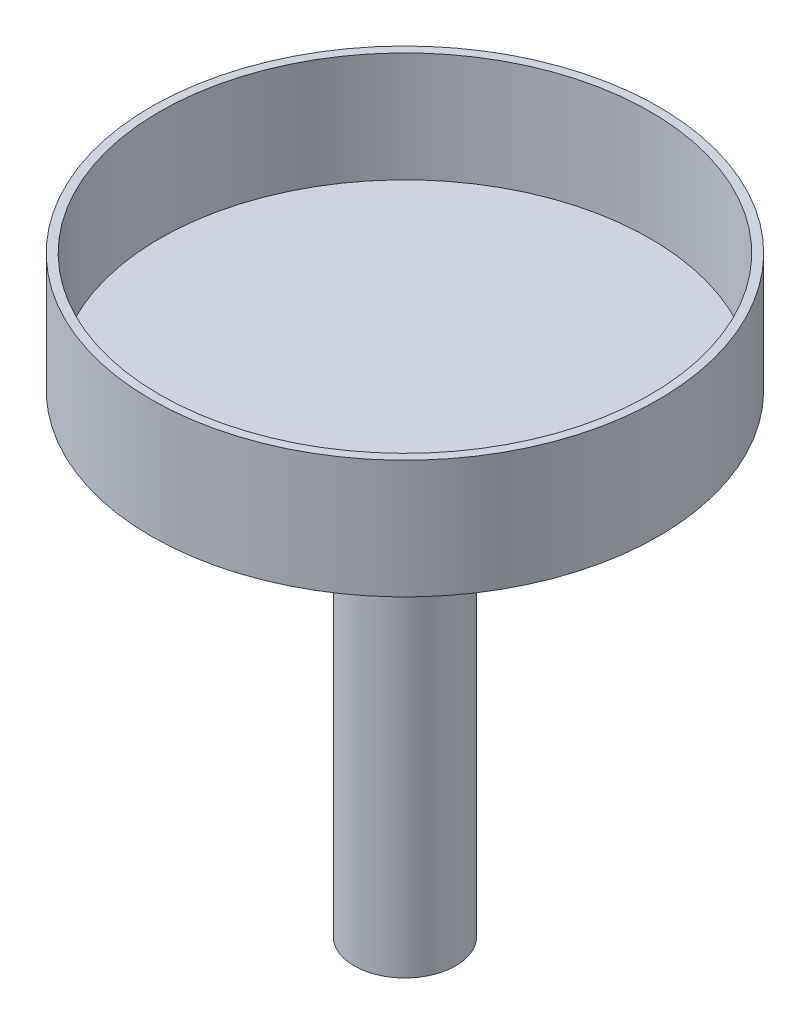
ISO-10303-21;
HEADER;
FILE_DESCRIPTION(('STEP AP214'),'2;1');
FILE_NAME('part.step','',(''),(''),'','','');
FILE_SCHEMA(('AUTOMOTIVE_DESIGN { 1 0 10303 214 1 1 1 1 }'));
ENDSEC;
DATA;
#1=APPLICATION_CONTEXT('core data for automotive mechanical design processes');
#2=APPLICATION_PROTOCOL_DEFINITION('international standard','automotive_design',2000,#1);
#3=PRODUCT_CONTEXT('',#1,'mechanical');
#4=PRODUCT('Part','Part','',(#3));
#5=PRODUCT_RELATED_PRODUCT_CATEGORY('part','',(#4));
#6=PRODUCT_DEFINITION_FORMATION('','',#4);
#7=PRODUCT_DEFINITION_CONTEXT('part definition',#1,'design');
#8=PRODUCT_DEFINITION('design','',#6,#7);
#9=PRODUCT_DEFINITION_SHAPE('','',#8);
#10=(LENGTH_UNIT() NAMED_UNIT(*) SI_UNIT(.MILLI.,.METRE.));
#11=(NAMED_UNIT(*) PLANE_ANGLE_UNIT() SI_UNIT($,.RADIAN.));
#12=(NAMED_UNIT(*) SI_UNIT($,.STERADIAN.) SOLID_ANGLE_UNIT());
#13=UNCERTAINTY_MEASURE_WITH_UNIT(LENGTH_MEASURE(1.E-05),#10,'distance_accuracy_value','');
#14=(GEOMETRIC_REPRESENTATION_CONTEXT(3) GLOBAL_UNCERTAINTY_ASSIGNED_CONTEXT((#13)) GLOBAL_UNIT_ASSIGNED_CONTEXT((#10,
#11,#12)) REPRESENTATION_CONTEXT('',''));
#15=CARTESIAN_POINT('',(0.,0.,0.));
#16=DIRECTION('',(0.,0.,1.));
#17=DIRECTION('',(1.,0.,0.));
#18=AXIS2_PLACEMENT_3D('',#15,#16,#17);
#19=CARTESIAN_POINT('',(0.,-280.,0.));
#20=DIRECTION('',(0.,1.,0.));
#21=DIRECTION('',(0.,0.,1.));
#22=AXIS2_PLACEMENT_3D('',#19,#20,#21);
#23=PLANE('',#22);
#24=CARTESIAN_POINT('',(0.,-280.,0.));
#25=DIRECTION('',(0.,1.,0.));
#26=DIRECTION('',(0.,0.,1.));
#27=AXIS2_PLACEMENT_3D('',#24,#25,#26);
#28=CIRCLE('',#27,30.);
#29=CARTESIAN_POINT('',(0.,-280.,30.));
#30=VERTEX_POINT('',#29);
#31=EDGE_CURVE('E10',#30,#30,#28,.T.);
#32=ORIENTED_EDGE('',*,*,#31,.F.);
#33=EDGE_LOOP('',(#32));
#34=FACE_BOUND('',#33,.T.);
#35=ADVANCED_FACE('F36',(#34),#23,.F.);
#36=CARTESIAN_POINT('',(0.,21.6796875000001,0.));
#37=DIRECTION('',(0.,1.,0.));
#38=DIRECTION('',(0.,0.,1.));
#39=AXIS2_PLACEMENT_3D('',#36,#37,#38);
#40=CYLINDRICAL_SURFACE('',#39,30.);
#41=CARTESIAN_POINT('',(0.,0.,0.));
#42=DIRECTION('',(0.,1.,0.));
#43=DIRECTION('',(0.,0.,1.));
#44=AXIS2_PLACEMENT_3D('',#41,#42,#43);
#45=CIRCLE('',#44,30.);
#46=CARTESIAN_POINT('',(0.,0.,30.));
#47=VERTEX_POINT('',#46);
#48=EDGE_CURVE('E42',#47,#47,#45,.T.);
#49=ORIENTED_EDGE('',*,*,#48,.F.);
#50=EDGE_LOOP('',(#49));
#51=FACE_BOUND('',#50,.T.);
#52=ORIENTED_EDGE('',*,*,#31,.T.);
#53=EDGE_LOOP('',(#52));
#54=FACE_BOUND('',#53,.T.);
#55=ADVANCED_FACE('F84',(#51,#54),#40,.T.);
#56=CARTESIAN_POINT('',(30.,0.,0.));
#57=DIRECTION('',(0.,1.,0.));
#58=DIRECTION('',(0.,0.,1.));
#59=AXIS2_PLACEMENT_3D('',#56,#57,#58);
#60=PLANE('',#59);
#61=CARTESIAN_POINT('',(0.,0.,0.));
#62=DIRECTION('',(0.,1.,0.));
#63=DIRECTION('',(0.,0.,1.));
#64=AXIS2_PLACEMENT_3D('',#61,#62,#63);
#65=CIRCLE('',#64,150.);
#66=CARTESIAN_POINT('',(0.,0.,150.));
#67=VERTEX_POINT('',#66);
#68=EDGE_CURVE('E46',#67,#67,#65,.T.);
#69=ORIENTED_EDGE('',*,*,#68,.F.);
#70=EDGE_LOOP('',(#69));
#71=FACE_BOUND('',#70,.T.);
#72=ORIENTED_EDGE('',*,*,#48,.T.);
#73=EDGE_LOOP('',(#72));
#74=FACE_BOUND('',#73,.T.);
#75=ADVANCED_FACE('F79',(#71,#74),#60,.F.);
#76=CARTESIAN_POINT('',(0.,21.6796875000001,0.));
#77=DIRECTION('',(0.,1.,0.));
#78=DIRECTION('',(0.,0.,1.));
#79=AXIS2_PLACEMENT_3D('',#76,#77,#78);
#80=CYLINDRICAL_SURFACE('',#79,150.);
#81=CARTESIAN_POINT('',(0.,70.,0.));
#82=DIRECTION('',(0.,1.,0.));
#83=DIRECTION('',(0.,0.,1.));
#84=AXIS2_PLACEMENT_3D('',#81,#82,#83);
#85=CIRCLE('',#84,150.);
#86=CARTESIAN_POINT('',(0.,70.,150.));
#87=VERTEX_POINT('',#86);
#88=EDGE_CURVE('E50',#87,#87,#85,.T.);
#89=ORIENTED_EDGE('',*,*,#88,.F.);
#90=EDGE_LOOP('',(#89));
#91=FACE_BOUND('',#90,.T.);
#92=ORIENTED_EDGE('',*,*,#68,.T.);
#93=EDGE_LOOP('',(#92));
#94=FACE_BOUND('',#93,.T.);
#95=ADVANCED_FACE('F73',(#91,#94),#80,.T.);
#96=CARTESIAN_POINT('',(150.,70.,0.));
#97=DIRECTION('',(0.,-1.,0.));
#98=DIRECTION('',(0.,0.,-1.));
#99=AXIS2_PLACEMENT_3D('',#96,#97,#98);
#100=PLANE('',#99);
#101=CARTESIAN_POINT('',(0.,70.,0.));
#102=DIRECTION('',(0.,1.,0.));
#103=DIRECTION('',(0.,0.,1.));
#104=AXIS2_PLACEMENT_3D('',#101,#102,#103);
#105=CIRCLE('',#104,145.);
#106=CARTESIAN_POINT('',(0.,70.,145.));
#107=VERTEX_POINT('',#106);
#108=EDGE_CURVE('E55',#107,#107,#105,.T.);
#109=ORIENTED_EDGE('',*,*,#108,.F.);
#110=EDGE_LOOP('',(#109));
#111=FACE_BOUND('',#110,.T.);
#112=ORIENTED_EDGE('',*,*,#88,.T.);
#113=EDGE_LOOP('',(#112));
#114=FACE_BOUND('',#113,.T.);
#115=ADVANCED_FACE('F67',(#111,#114),#100,.F.);
#116=CARTESIAN_POINT('',(0.,21.6796875000001,0.));
#117=DIRECTION('',(0.,1.,0.));
#118=DIRECTION('',(0.,0.,1.));
#119=AXIS2_PLACEMENT_3D('',#116,#117,#118);
#120=CYLINDRICAL_SURFACE('',#119,145.);
#121=CARTESIAN_POINT('',(0.,5.00000000000002,0.));
#122=DIRECTION('',(0.,1.,0.));
#123=DIRECTION('',(0.,0.,1.));
#124=AXIS2_PLACEMENT_3D('',#121,#122,#123);
#125=CIRCLE('',#124,145.);
#126=CARTESIAN_POINT('',(0.,5.00000000000002,145.));
#127=VERTEX_POINT('',#126);
#128=EDGE_CURVE('E58',#127,#127,#125,.T.);
#129=ORIENTED_EDGE('',*,*,#128,.F.);
#130=EDGE_LOOP('',(#129));
#131=FACE_BOUND('',#130,.T.);
#132=ORIENTED_EDGE('',*,*,#108,.T.);
#133=EDGE_LOOP('',(#132));
#134=FACE_BOUND('',#133,.T.);
#135=ADVANCED_FACE('F64',(#131,#134),#120,.F.);
#136=CARTESIAN_POINT('',(145.,5.00000000000001,0.));
#137=DIRECTION('',(0.,-1.,0.));
#138=DIRECTION('',(0.,0.,-1.));
#139=AXIS2_PLACEMENT_3D('',#136,#137,#138);
#140=PLANE('',#139);
#141=ORIENTED_EDGE('',*,*,#128,.T.);
#142=EDGE_LOOP('',(#141));
#143=FACE_BOUND('',#142,.T.);
#144=ADVANCED_FACE('F62',(#143),#140,.F.);
#145=CLOSED_SHELL('',(#35,#55,#75,#95,#115,#135,#144));
#146=MANIFOLD_SOLID_BREP('B2',#145);
#147=ADVANCED_BREP_SHAPE_REPRESENTATION('',(#18,#146),#14);
#148=SHAPE_DEFINITION_REPRESENTATION(#9,#147);
ENDSEC;
END-ISO-10303-21;
